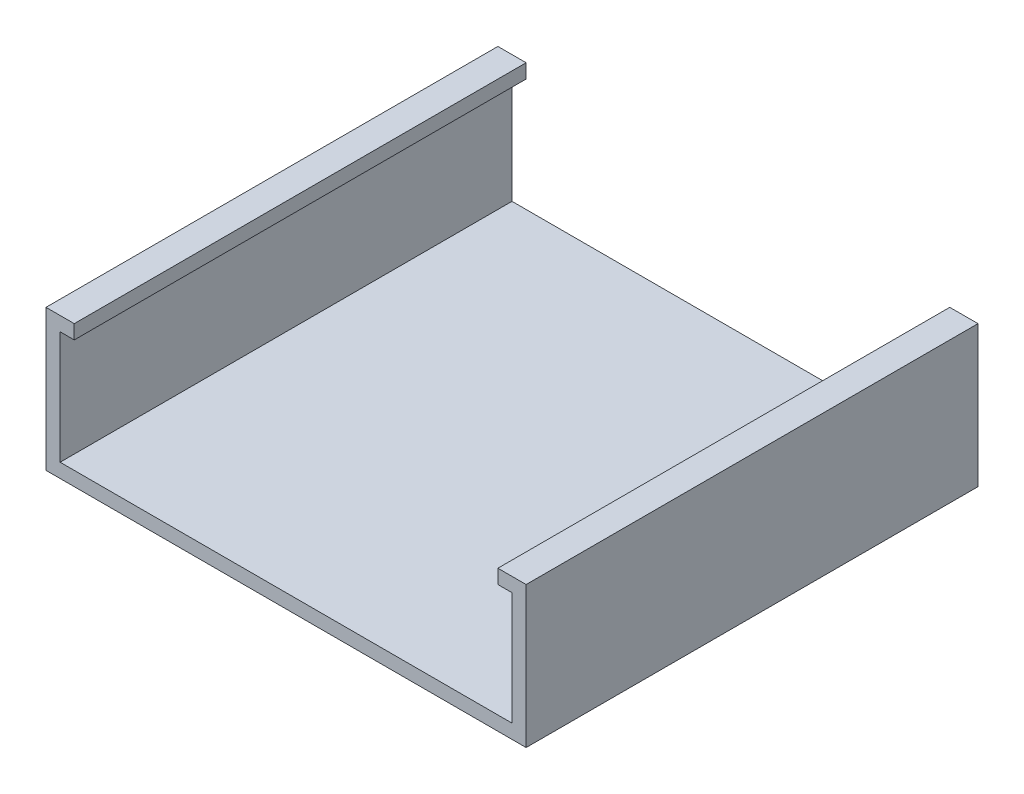
ISO-10303-21;
HEADER;
FILE_DESCRIPTION(('STEP AP214'),'2;1');
FILE_NAME('part.step','',(''),(''),'','','');
FILE_SCHEMA(('AUTOMOTIVE_DESIGN { 1 0 10303 214 1 1 1 1 }'));
ENDSEC;
DATA;
#1=APPLICATION_CONTEXT('core data for automotive mechanical design processes');
#2=APPLICATION_PROTOCOL_DEFINITION('international standard','automotive_design',2000,#1);
#3=PRODUCT_CONTEXT('',#1,'mechanical');
#4=PRODUCT('Part','Part','',(#3));
#5=PRODUCT_RELATED_PRODUCT_CATEGORY('part','',(#4));
#6=PRODUCT_DEFINITION_FORMATION('','',#4);
#7=PRODUCT_DEFINITION_CONTEXT('part definition',#1,'design');
#8=PRODUCT_DEFINITION('design','',#6,#7);
#9=PRODUCT_DEFINITION_SHAPE('','',#8);
#10=(LENGTH_UNIT() NAMED_UNIT(*) SI_UNIT(.MILLI.,.METRE.));
#11=(NAMED_UNIT(*) PLANE_ANGLE_UNIT() SI_UNIT($,.RADIAN.));
#12=(NAMED_UNIT(*) SI_UNIT($,.STERADIAN.) SOLID_ANGLE_UNIT());
#13=UNCERTAINTY_MEASURE_WITH_UNIT(LENGTH_MEASURE(1.E-05),#10,'distance_accuracy_value','');
#14=(GEOMETRIC_REPRESENTATION_CONTEXT(3) GLOBAL_UNCERTAINTY_ASSIGNED_CONTEXT((#13)) GLOBAL_UNIT_ASSIGNED_CONTEXT((#10,
#11,#12)) REPRESENTATION_CONTEXT('',''));
#15=CARTESIAN_POINT('',(0.,0.,0.));
#16=DIRECTION('',(0.,0.,1.));
#17=DIRECTION('',(1.,0.,0.));
#18=AXIS2_PLACEMENT_3D('',#15,#16,#17);
#19=CARTESIAN_POINT('',(0.,50.,0.));
#20=DIRECTION('',(0.,1.,0.));
#21=DIRECTION('',(0.,0.,1.));
#22=AXIS2_PLACEMENT_3D('',#19,#20,#21);
#23=PLANE('',#22);
#24=DIRECTION('',(0.,0.,1.));
#25=VECTOR('',#24,1.);
#26=CARTESIAN_POINT('',(-75.,50.,-80.));
#27=LINE('',#26,#25);
#28=CARTESIAN_POINT('',(-75.,50.,-80.));
#29=VERTEX_POINT('',#28);
#30=CARTESIAN_POINT('',(-75.,50.,80.));
#31=VERTEX_POINT('',#30);
#32=EDGE_CURVE('E129',#29,#31,#27,.T.);
#33=ORIENTED_EDGE('',*,*,#32,.F.);
#34=DIRECTION('',(-1.,0.,0.));
#35=VECTOR('',#34,1.);
#36=CARTESIAN_POINT('',(-85.,50.,-80.));
#37=LINE('',#36,#35);
#38=CARTESIAN_POINT('',(-85.,50.,-80.));
#39=VERTEX_POINT('',#38);
#40=EDGE_CURVE('E202',#29,#39,#37,.T.);
#41=ORIENTED_EDGE('',*,*,#40,.T.);
#42=DIRECTION('',(0.,0.,1.));
#43=VECTOR('',#42,1.);
#44=CARTESIAN_POINT('',(-85.,50.,-80.));
#45=LINE('',#44,#43);
#46=CARTESIAN_POINT('',(-85.,50.,80.));
#47=VERTEX_POINT('',#46);
#48=EDGE_CURVE('E152',#39,#47,#45,.T.);
#49=ORIENTED_EDGE('',*,*,#48,.T.);
#50=DIRECTION('',(1.,0.,0.));
#51=VECTOR('',#50,1.);
#52=CARTESIAN_POINT('',(-85.,50.,80.));
#53=LINE('',#52,#51);
#54=EDGE_CURVE('E145',#47,#31,#53,.T.);
#55=ORIENTED_EDGE('',*,*,#54,.T.);
#56=EDGE_LOOP('',(#33,#41,#49,#55));
#57=FACE_BOUND('',#56,.T.);
#58=ADVANCED_FACE('F41',(#57),#23,.T.);
#59=CARTESIAN_POINT('',(-80.,45.,-80.001));
#60=DIRECTION('',(0.,1.,0.));
#61=DIRECTION('',(0.,0.,1.));
#62=AXIS2_PLACEMENT_3D('',#59,#60,#61);
#63=PLANE('',#62);
#64=DIRECTION('',(1.,0.,0.));
#65=VECTOR('',#64,1.);
#66=CARTESIAN_POINT('',(-80.,45.,-80.));
#67=LINE('',#66,#65);
#68=CARTESIAN_POINT('',(-80.,45.,-80.));
#69=VERTEX_POINT('',#68);
#70=CARTESIAN_POINT('',(-75.,45.,-80.));
#71=VERTEX_POINT('',#70);
#72=EDGE_CURVE('E227',#69,#71,#67,.T.);
#73=ORIENTED_EDGE('',*,*,#72,.T.);
#74=DIRECTION('',(0.,0.,-1.));
#75=VECTOR('',#74,1.);
#76=CARTESIAN_POINT('',(-75.,45.,-80.));
#77=LINE('',#76,#75);
#78=CARTESIAN_POINT('',(-75.,45.,80.));
#79=VERTEX_POINT('',#78);
#80=EDGE_CURVE('E138',#79,#71,#77,.T.);
#81=ORIENTED_EDGE('',*,*,#80,.F.);
#82=DIRECTION('',(-1.,0.,0.));
#83=VECTOR('',#82,1.);
#84=CARTESIAN_POINT('',(-80.,45.,80.));
#85=LINE('',#84,#83);
#86=CARTESIAN_POINT('',(-80.,45.,80.));
#87=VERTEX_POINT('',#86);
#88=EDGE_CURVE('E147',#79,#87,#85,.T.);
#89=ORIENTED_EDGE('',*,*,#88,.T.);
#90=DIRECTION('',(0.,0.,1.));
#91=VECTOR('',#90,1.);
#92=CARTESIAN_POINT('',(-80.,45.,-80.001));
#93=LINE('',#92,#91);
#94=EDGE_CURVE('E251',#69,#87,#93,.T.);
#95=ORIENTED_EDGE('',*,*,#94,.F.);
#96=EDGE_LOOP('',(#73,#81,#89,#95));
#97=FACE_BOUND('',#96,.T.);
#98=ADVANCED_FACE('F280',(#97),#63,.F.);
#99=CARTESIAN_POINT('',(85.,50.,-80.));
#100=DIRECTION('',(-1.,0.,0.));
#101=DIRECTION('',(0.,0.,1.));
#102=AXIS2_PLACEMENT_3D('',#99,#100,#101);
#103=PLANE('',#102);
#104=DIRECTION('',(0.,0.,-1.));
#105=VECTOR('',#104,1.);
#106=CARTESIAN_POINT('',(85.,0.,-80.));
#107=LINE('',#106,#105);
#108=CARTESIAN_POINT('',(85.,0.,80.));
#109=VERTEX_POINT('',#108);
#110=CARTESIAN_POINT('',(85.,0.,-80.));
#111=VERTEX_POINT('',#110);
#112=EDGE_CURVE('E166',#109,#111,#107,.T.);
#113=ORIENTED_EDGE('',*,*,#112,.T.);
#114=DIRECTION('',(0.,-1.,0.));
#115=VECTOR('',#114,1.);
#116=CARTESIAN_POINT('',(85.,50.,-80.));
#117=LINE('',#116,#115);
#118=CARTESIAN_POINT('',(85.,50.,-80.));
#119=VERTEX_POINT('',#118);
#120=EDGE_CURVE('E11',#119,#111,#117,.T.);
#121=ORIENTED_EDGE('',*,*,#120,.F.);
#122=DIRECTION('',(0.,0.,-1.));
#123=VECTOR('',#122,1.);
#124=CARTESIAN_POINT('',(85.,50.,-80.));
#125=LINE('',#124,#123);
#126=CARTESIAN_POINT('',(85.,50.,80.));
#127=VERTEX_POINT('',#126);
#128=EDGE_CURVE('E179',#127,#119,#125,.T.);
#129=ORIENTED_EDGE('',*,*,#128,.F.);
#130=DIRECTION('',(0.,-1.,0.));
#131=VECTOR('',#130,1.);
#132=CARTESIAN_POINT('',(85.,50.,80.));
#133=LINE('',#132,#131);
#134=EDGE_CURVE('E155',#127,#109,#133,.T.);
#135=ORIENTED_EDGE('',*,*,#134,.T.);
#136=EDGE_LOOP('',(#113,#121,#129,#135));
#137=FACE_BOUND('',#136,.T.);
#138=ADVANCED_FACE('F43',(#137),#103,.F.);
#139=CARTESIAN_POINT('',(-85.,50.,-80.));
#140=DIRECTION('',(0.,0.,1.));
#141=DIRECTION('',(1.,0.,0.));
#142=AXIS2_PLACEMENT_3D('',#139,#140,#141);
#143=PLANE('',#142);
#144=ORIENTED_EDGE('',*,*,#40,.F.);
#145=DIRECTION('',(0.,1.,0.));
#146=VECTOR('',#145,1.);
#147=CARTESIAN_POINT('',(-75.,-0.001000000000001,-80.));
#148=LINE('',#147,#146);
#149=EDGE_CURVE('E132',#71,#29,#148,.T.);
#150=ORIENTED_EDGE('',*,*,#149,.F.);
#151=ORIENTED_EDGE('',*,*,#72,.F.);
#152=DIRECTION('',(0.,1.,0.));
#153=VECTOR('',#152,1.);
#154=CARTESIAN_POINT('',(-80.,45.,-80.));
#155=LINE('',#154,#153);
#156=CARTESIAN_POINT('',(-80.,5.,-80.));
#157=VERTEX_POINT('',#156);
#158=EDGE_CURVE('E231',#157,#69,#155,.T.);
#159=ORIENTED_EDGE('',*,*,#158,.F.);
#160=DIRECTION('',(-1.,0.,0.));
#161=VECTOR('',#160,1.);
#162=CARTESIAN_POINT('',(-80.,5.,-80.));
#163=LINE('',#162,#161);
#164=CARTESIAN_POINT('',(80.,5.,-80.));
#165=VERTEX_POINT('',#164);
#166=EDGE_CURVE('E171',#165,#157,#163,.T.);
#167=ORIENTED_EDGE('',*,*,#166,.F.);
#168=DIRECTION('',(0.,-1.,0.));
#169=VECTOR('',#168,1.);
#170=CARTESIAN_POINT('',(80.,45.,-80.));
#171=LINE('',#170,#169);
#172=CARTESIAN_POINT('',(80.,45.,-80.));
#173=VERTEX_POINT('',#172);
#174=EDGE_CURVE('E220',#173,#165,#171,.T.);
#175=ORIENTED_EDGE('',*,*,#174,.F.);
#176=CARTESIAN_POINT('',(75.,45.,-80.));
#177=VERTEX_POINT('',#176);
#178=EDGE_CURVE('E215',#177,#173,#67,.T.);
#179=ORIENTED_EDGE('',*,*,#178,.F.);
#180=DIRECTION('',(0.,1.,0.));
#181=VECTOR('',#180,1.);
#182=CARTESIAN_POINT('',(75.,-0.001000000000001,-80.));
#183=LINE('',#182,#181);
#184=CARTESIAN_POINT('',(75.,50.,-80.));
#185=VERTEX_POINT('',#184);
#186=EDGE_CURVE('E65',#177,#185,#183,.T.);
#187=ORIENTED_EDGE('',*,*,#186,.T.);
#188=EDGE_CURVE('E205',#119,#185,#37,.T.);
#189=ORIENTED_EDGE('',*,*,#188,.F.);
#190=ORIENTED_EDGE('',*,*,#120,.T.);
#191=DIRECTION('',(-1.,0.,0.));
#192=VECTOR('',#191,1.);
#193=CARTESIAN_POINT('',(-85.,0.,-80.));
#194=LINE('',#193,#192);
#195=CARTESIAN_POINT('',(-85.,0.,-80.));
#196=VERTEX_POINT('',#195);
#197=EDGE_CURVE('E170',#111,#196,#194,.T.);
#198=ORIENTED_EDGE('',*,*,#197,.T.);
#199=DIRECTION('',(0.,-1.,0.));
#200=VECTOR('',#199,1.);
#201=CARTESIAN_POINT('',(-85.,50.,-80.));
#202=LINE('',#201,#200);
#203=EDGE_CURVE('E50',#39,#196,#202,.T.);
#204=ORIENTED_EDGE('',*,*,#203,.F.);
#205=EDGE_LOOP('',(#144,#150,#151,#159,#167,#175,#179,#187,#189,#190,#198,#204));
#206=FACE_BOUND('',#205,.T.);
#207=ADVANCED_FACE('F212',(#206),#143,.F.);
#208=CARTESIAN_POINT('',(-85.,50.,-80.));
#209=DIRECTION('',(1.,0.,0.));
#210=DIRECTION('',(0.,0.,-1.));
#211=AXIS2_PLACEMENT_3D('',#208,#209,#210);
#212=PLANE('',#211);
#213=DIRECTION('',(0.,0.,1.));
#214=VECTOR('',#213,1.);
#215=CARTESIAN_POINT('',(-85.,0.,-80.));
#216=LINE('',#215,#214);
#217=CARTESIAN_POINT('',(-85.,0.,80.));
#218=VERTEX_POINT('',#217);
#219=EDGE_CURVE('E174',#196,#218,#216,.T.);
#220=ORIENTED_EDGE('',*,*,#219,.T.);
#221=DIRECTION('',(0.,-1.,0.));
#222=VECTOR('',#221,1.);
#223=CARTESIAN_POINT('',(-85.,50.,80.));
#224=LINE('',#223,#222);
#225=EDGE_CURVE('E161',#47,#218,#224,.T.);
#226=ORIENTED_EDGE('',*,*,#225,.F.);
#227=ORIENTED_EDGE('',*,*,#48,.F.);
#228=ORIENTED_EDGE('',*,*,#203,.T.);
#229=EDGE_LOOP('',(#220,#226,#227,#228));
#230=FACE_BOUND('',#229,.T.);
#231=ADVANCED_FACE('F187',(#230),#212,.F.);
#232=CARTESIAN_POINT('',(-85.,50.,80.));
#233=DIRECTION('',(0.,0.,-1.));
#234=DIRECTION('',(-1.,0.,0.));
#235=AXIS2_PLACEMENT_3D('',#232,#233,#234);
#236=PLANE('',#235);
#237=ORIENTED_EDGE('',*,*,#88,.F.);
#238=DIRECTION('',(0.,1.,0.));
#239=VECTOR('',#238,1.);
#240=CARTESIAN_POINT('',(-75.,-0.001000000000001,80.));
#241=LINE('',#240,#239);
#242=EDGE_CURVE('E57',#79,#31,#241,.T.);
#243=ORIENTED_EDGE('',*,*,#242,.T.);
#244=ORIENTED_EDGE('',*,*,#54,.F.);
#245=ORIENTED_EDGE('',*,*,#225,.T.);
#246=DIRECTION('',(1.,0.,0.));
#247=VECTOR('',#246,1.);
#248=CARTESIAN_POINT('',(-85.,0.,80.));
#249=LINE('',#248,#247);
#250=EDGE_CURVE('E177',#218,#109,#249,.T.);
#251=ORIENTED_EDGE('',*,*,#250,.T.);
#252=ORIENTED_EDGE('',*,*,#134,.F.);
#253=CARTESIAN_POINT('',(75.0000000000001,50.,80.));
#254=VERTEX_POINT('',#253);
#255=EDGE_CURVE('E156',#254,#127,#53,.T.);
#256=ORIENTED_EDGE('',*,*,#255,.F.);
#257=DIRECTION('',(0.,1.,0.));
#258=VECTOR('',#257,1.);
#259=CARTESIAN_POINT('',(75.0000000000001,-0.001000000000001,80.));
#260=LINE('',#259,#258);
#261=CARTESIAN_POINT('',(75.0000000000001,45.,80.));
#262=VERTEX_POINT('',#261);
#263=EDGE_CURVE('E149',#262,#254,#260,.T.);
#264=ORIENTED_EDGE('',*,*,#263,.F.);
#265=CARTESIAN_POINT('',(80.,45.,80.));
#266=VERTEX_POINT('',#265);
#267=EDGE_CURVE('E246',#266,#262,#85,.T.);
#268=ORIENTED_EDGE('',*,*,#267,.F.);
#269=DIRECTION('',(0.,1.,0.));
#270=VECTOR('',#269,1.);
#271=CARTESIAN_POINT('',(80.,45.,80.));
#272=LINE('',#271,#270);
#273=CARTESIAN_POINT('',(80.,5.,80.));
#274=VERTEX_POINT('',#273);
#275=EDGE_CURVE('E242',#274,#266,#272,.T.);
#276=ORIENTED_EDGE('',*,*,#275,.F.);
#277=DIRECTION('',(1.,0.,0.));
#278=VECTOR('',#277,1.);
#279=CARTESIAN_POINT('',(-80.,5.,80.));
#280=LINE('',#279,#278);
#281=CARTESIAN_POINT('',(-80.,5.,80.));
#282=VERTEX_POINT('',#281);
#283=EDGE_CURVE('E238',#282,#274,#280,.T.);
#284=ORIENTED_EDGE('',*,*,#283,.F.);
#285=DIRECTION('',(0.,-1.,0.));
#286=VECTOR('',#285,1.);
#287=CARTESIAN_POINT('',(-80.,45.,80.));
#288=LINE('',#287,#286);
#289=EDGE_CURVE('E235',#87,#282,#288,.T.);
#290=ORIENTED_EDGE('',*,*,#289,.F.);
#291=EDGE_LOOP('',(#237,#243,#244,#245,#251,#252,#256,#264,#268,#276,#284,#290));
#292=FACE_BOUND('',#291,.T.);
#293=ADVANCED_FACE('F143',(#292),#236,.F.);
#294=DIRECTION('',(0.,0.,-1.));
#295=VECTOR('',#294,1.);
#296=CARTESIAN_POINT('',(75.,50.,-80.));
#297=LINE('',#296,#295);
#298=EDGE_CURVE('E137',#254,#185,#297,.T.);
#299=ORIENTED_EDGE('',*,*,#298,.F.);
#300=ORIENTED_EDGE('',*,*,#255,.T.);
#301=ORIENTED_EDGE('',*,*,#128,.T.);
#302=ORIENTED_EDGE('',*,*,#188,.T.);
#303=EDGE_LOOP('',(#299,#300,#301,#302));
#304=FACE_BOUND('',#303,.T.);
#305=ADVANCED_FACE('F211',(#304),#23,.T.);
#306=CARTESIAN_POINT('',(0.,0.,0.));
#307=DIRECTION('',(0.,1.,0.));
#308=DIRECTION('',(0.,0.,1.));
#309=AXIS2_PLACEMENT_3D('',#306,#307,#308);
#310=PLANE('',#309);
#311=ORIENTED_EDGE('',*,*,#112,.F.);
#312=ORIENTED_EDGE('',*,*,#250,.F.);
#313=ORIENTED_EDGE('',*,*,#219,.F.);
#314=ORIENTED_EDGE('',*,*,#197,.F.);
#315=EDGE_LOOP('',(#311,#312,#313,#314));
#316=FACE_BOUND('',#315,.T.);
#317=ADVANCED_FACE('F192',(#316),#310,.F.);
#318=CARTESIAN_POINT('',(-80.,45.,-80.001));
#319=DIRECTION('',(-1.,0.,0.));
#320=DIRECTION('',(0.,0.,1.));
#321=AXIS2_PLACEMENT_3D('',#318,#319,#320);
#322=PLANE('',#321);
#323=ORIENTED_EDGE('',*,*,#158,.T.);
#324=ORIENTED_EDGE('',*,*,#94,.T.);
#325=ORIENTED_EDGE('',*,*,#289,.T.);
#326=DIRECTION('',(0.,0.,1.));
#327=VECTOR('',#326,1.);
#328=CARTESIAN_POINT('',(-80.,5.,-80.001));
#329=LINE('',#328,#327);
#330=EDGE_CURVE('E250',#157,#282,#329,.T.);
#331=ORIENTED_EDGE('',*,*,#330,.F.);
#332=EDGE_LOOP('',(#323,#324,#325,#331));
#333=FACE_BOUND('',#332,.T.);
#334=ADVANCED_FACE('F278',(#333),#322,.F.);
#335=ORIENTED_EDGE('',*,*,#267,.T.);
#336=DIRECTION('',(0.,0.,1.));
#337=VECTOR('',#336,1.);
#338=CARTESIAN_POINT('',(75.,45.,-80.));
#339=LINE('',#338,#337);
#340=EDGE_CURVE('E285',#177,#262,#339,.T.);
#341=ORIENTED_EDGE('',*,*,#340,.F.);
#342=ORIENTED_EDGE('',*,*,#178,.T.);
#343=DIRECTION('',(0.,0.,1.));
#344=VECTOR('',#343,1.);
#345=CARTESIAN_POINT('',(80.,45.,-80.001));
#346=LINE('',#345,#344);
#347=EDGE_CURVE('E255',#173,#266,#346,.T.);
#348=ORIENTED_EDGE('',*,*,#347,.T.);
#349=EDGE_LOOP('',(#335,#341,#342,#348));
#350=FACE_BOUND('',#349,.T.);
#351=ADVANCED_FACE('F284',(#350),#63,.F.);
#352=CARTESIAN_POINT('',(80.,45.,-80.001));
#353=DIRECTION('',(1.,0.,0.));
#354=DIRECTION('',(0.,0.,-1.));
#355=AXIS2_PLACEMENT_3D('',#352,#353,#354);
#356=PLANE('',#355);
#357=ORIENTED_EDGE('',*,*,#174,.T.);
#358=DIRECTION('',(0.,0.,1.));
#359=VECTOR('',#358,1.);
#360=CARTESIAN_POINT('',(80.,5.,-80.001));
#361=LINE('',#360,#359);
#362=EDGE_CURVE('E258',#165,#274,#361,.T.);
#363=ORIENTED_EDGE('',*,*,#362,.T.);
#364=ORIENTED_EDGE('',*,*,#275,.T.);
#365=ORIENTED_EDGE('',*,*,#347,.F.);
#366=EDGE_LOOP('',(#357,#363,#364,#365));
#367=FACE_BOUND('',#366,.T.);
#368=ADVANCED_FACE('F275',(#367),#356,.F.);
#369=CARTESIAN_POINT('',(-80.,5.,-80.001));
#370=DIRECTION('',(0.,-1.,0.));
#371=DIRECTION('',(0.,0.,-1.));
#372=AXIS2_PLACEMENT_3D('',#369,#370,#371);
#373=PLANE('',#372);
#374=ORIENTED_EDGE('',*,*,#166,.T.);
#375=ORIENTED_EDGE('',*,*,#330,.T.);
#376=ORIENTED_EDGE('',*,*,#283,.T.);
#377=ORIENTED_EDGE('',*,*,#362,.F.);
#378=EDGE_LOOP('',(#374,#375,#376,#377));
#379=FACE_BOUND('',#378,.T.);
#380=ADVANCED_FACE('F265',(#379),#373,.F.);
#381=CARTESIAN_POINT('',(75.,-0.001000000000001,-80.));
#382=DIRECTION('',(1.,0.,0.));
#383=DIRECTION('',(0.,0.,-1.));
#384=AXIS2_PLACEMENT_3D('',#381,#382,#383);
#385=PLANE('',#384);
#386=ORIENTED_EDGE('',*,*,#340,.T.);
#387=ORIENTED_EDGE('',*,*,#263,.T.);
#388=ORIENTED_EDGE('',*,*,#298,.T.);
#389=ORIENTED_EDGE('',*,*,#186,.F.);
#390=EDGE_LOOP('',(#386,#387,#388,#389));
#391=FACE_BOUND('',#390,.T.);
#392=ADVANCED_FACE('F291',(#391),#385,.F.);
#393=CARTESIAN_POINT('',(-75.,-0.001000000000001,-80.));
#394=DIRECTION('',(-1.,0.,0.));
#395=DIRECTION('',(0.,0.,1.));
#396=AXIS2_PLACEMENT_3D('',#393,#394,#395);
#397=PLANE('',#396);
#398=ORIENTED_EDGE('',*,*,#80,.T.);
#399=ORIENTED_EDGE('',*,*,#149,.T.);
#400=ORIENTED_EDGE('',*,*,#32,.T.);
#401=ORIENTED_EDGE('',*,*,#242,.F.);
#402=EDGE_LOOP('',(#398,#399,#400,#401));
#403=FACE_BOUND('',#402,.T.);
#404=ADVANCED_FACE('F130',(#403),#397,.F.);
#405=CLOSED_SHELL('',(#58,#98,#138,#207,#231,#293,#305,#317,#334,#351,#368,#380,#392,#404));
#406=MANIFOLD_SOLID_BREP('B2',#405);
#407=ADVANCED_BREP_SHAPE_REPRESENTATION('',(#18,#406),#14);
#408=SHAPE_DEFINITION_REPRESENTATION(#9,#407);
ENDSEC;
END-ISO-10303-21;
